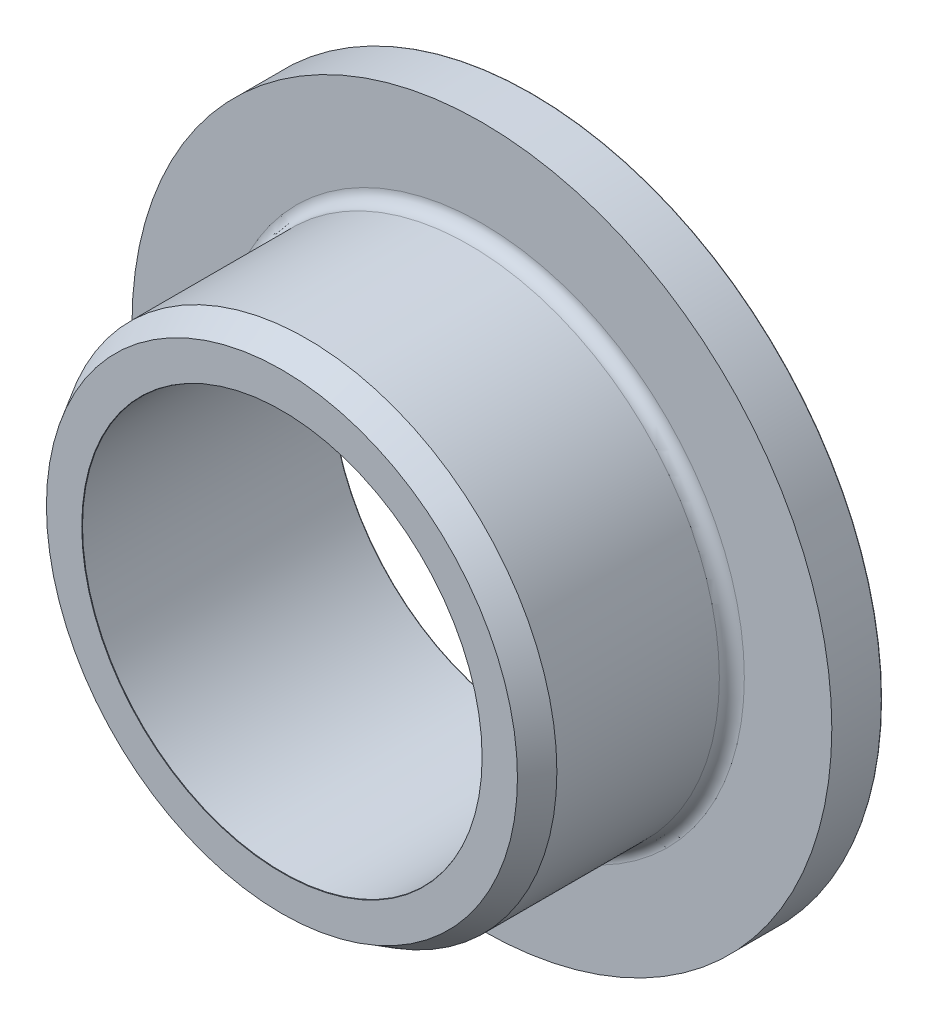
ISO-10303-21;
HEADER;
FILE_DESCRIPTION(('STEP AP214'),'2;1');
FILE_NAME('part.step','',(''),(''),'','','');
FILE_SCHEMA(('AUTOMOTIVE_DESIGN { 1 0 10303 214 1 1 1 1 }'));
ENDSEC;
DATA;
#1=APPLICATION_CONTEXT('core data for automotive mechanical design processes');
#2=APPLICATION_PROTOCOL_DEFINITION('international standard','automotive_design',2000,#1);
#3=PRODUCT_CONTEXT('',#1,'mechanical');
#4=PRODUCT('Part','Part','',(#3));
#5=PRODUCT_RELATED_PRODUCT_CATEGORY('part','',(#4));
#6=PRODUCT_DEFINITION_FORMATION('','',#4);
#7=PRODUCT_DEFINITION_CONTEXT('part definition',#1,'design');
#8=PRODUCT_DEFINITION('design','',#6,#7);
#9=PRODUCT_DEFINITION_SHAPE('','',#8);
#10=(LENGTH_UNIT() NAMED_UNIT(*) SI_UNIT(.MILLI.,.METRE.));
#11=(NAMED_UNIT(*) PLANE_ANGLE_UNIT() SI_UNIT($,.RADIAN.));
#12=(NAMED_UNIT(*) SI_UNIT($,.STERADIAN.) SOLID_ANGLE_UNIT());
#13=UNCERTAINTY_MEASURE_WITH_UNIT(LENGTH_MEASURE(1.E-05),#10,'distance_accuracy_value','');
#14=(GEOMETRIC_REPRESENTATION_CONTEXT(3) GLOBAL_UNCERTAINTY_ASSIGNED_CONTEXT((#13)) GLOBAL_UNIT_ASSIGNED_CONTEXT((#10,
#11,#12)) REPRESENTATION_CONTEXT('',''));
#15=CARTESIAN_POINT('',(0.,0.,0.));
#16=DIRECTION('',(0.,0.,1.));
#17=DIRECTION('',(1.,0.,0.));
#18=AXIS2_PLACEMENT_3D('',#15,#16,#17);
#19=CARTESIAN_POINT('',(0.,0.,4.5));
#20=DIRECTION('',(0.,0.,-1.));
#21=DIRECTION('',(1.,0.,0.));
#22=AXIS2_PLACEMENT_3D('',#19,#20,#21);
#23=CONICAL_SURFACE('',#22,5.,0.523598775598);
#24=DIRECTION('',(-0.50000000000019,0.,0.866025403784329));
#25=VECTOR('',#24,1.);
#26=CARTESIAN_POINT('',(5.,0.,4.5));
#27=LINE('',#26,#25);
#28=CARTESIAN_POINT('',(5.,0.,4.5));
#29=VERTEX_POINT('',#28);
#30=CARTESIAN_POINT('',(4.711324865405,0.,5.));
#31=VERTEX_POINT('',#30);
#32=EDGE_CURVE('E11',#29,#31,#27,.T.);
#33=ORIENTED_EDGE('',*,*,#32,.F.);
#34=CARTESIAN_POINT('',(0.,0.,4.5));
#35=DIRECTION('',(0.,0.,1.));
#36=DIRECTION('',(1.,0.,0.));
#37=AXIS2_PLACEMENT_3D('',#34,#35,#36);
#38=CIRCLE('',#37,5.);
#39=EDGE_CURVE('E136',#29,#29,#38,.T.);
#40=ORIENTED_EDGE('',*,*,#39,.T.);
#41=ORIENTED_EDGE('',*,*,#32,.T.);
#42=CARTESIAN_POINT('',(0.,0.,5.));
#43=DIRECTION('',(0.,0.,1.));
#44=DIRECTION('',(1.,0.,0.));
#45=AXIS2_PLACEMENT_3D('',#42,#43,#44);
#46=CIRCLE('',#45,4.711324865405);
#47=EDGE_CURVE('E111',#31,#31,#46,.T.);
#48=ORIENTED_EDGE('',*,*,#47,.F.);
#49=EDGE_LOOP('',(#33,#40,#41,#48));
#50=FACE_BOUND('',#49,.T.);
#51=ADVANCED_FACE('F17',(#50),#23,.T.);
#52=CARTESIAN_POINT('',(0.,0.,0.));
#53=DIRECTION('',(0.,0.,-1.));
#54=DIRECTION('',(1.,0.,0.));
#55=AXIS2_PLACEMENT_3D('',#52,#53,#54);
#56=CYLINDRICAL_SURFACE('',#55,5.);
#57=ORIENTED_EDGE('',*,*,#39,.F.);
#58=DIRECTION('',(0.,0.,1.));
#59=VECTOR('',#58,1.);
#60=CARTESIAN_POINT('',(5.,0.,0.));
#61=LINE('',#60,#59);
#62=CARTESIAN_POINT('',(5.,0.,1.2499));
#63=VERTEX_POINT('',#62);
#64=EDGE_CURVE('E25',#63,#29,#61,.T.);
#65=ORIENTED_EDGE('',*,*,#64,.F.);
#66=CARTESIAN_POINT('',(0.,0.,1.2499));
#67=DIRECTION('',(0.,0.,-1.));
#68=DIRECTION('',(1.,0.,0.));
#69=AXIS2_PLACEMENT_3D('',#66,#67,#68);
#70=CIRCLE('',#69,5.);
#71=EDGE_CURVE('E107',#63,#63,#70,.T.);
#72=ORIENTED_EDGE('',*,*,#71,.F.);
#73=ORIENTED_EDGE('',*,*,#64,.T.);
#74=EDGE_LOOP('',(#57,#65,#72,#73));
#75=FACE_BOUND('',#74,.T.);
#76=ADVANCED_FACE('F164',(#75),#56,.T.);
#77=CARTESIAN_POINT('',(0.,0.,5.));
#78=DIRECTION('',(0.,0.,1.));
#79=DIRECTION('',(1.,0.,0.));
#80=AXIS2_PLACEMENT_3D('',#77,#78,#79);
#81=PLANE('',#80);
#82=ORIENTED_EDGE('',*,*,#47,.T.);
#83=EDGE_LOOP('',(#82));
#84=FACE_BOUND('',#83,.T.);
#85=CARTESIAN_POINT('',(0.,0.,5.));
#86=DIRECTION('',(0.,0.,1.));
#87=DIRECTION('',(1.,0.,0.));
#88=AXIS2_PLACEMENT_3D('',#85,#86,#87);
#89=CIRCLE('',#88,4.004663076582);
#90=CARTESIAN_POINT('',(4.004663076582,0.,5.));
#91=VERTEX_POINT('',#90);
#92=EDGE_CURVE('E130',#91,#91,#89,.T.);
#93=ORIENTED_EDGE('',*,*,#92,.F.);
#94=EDGE_LOOP('',(#93));
#95=FACE_BOUND('',#94,.T.);
#96=ADVANCED_FACE('F166',(#84,#95),#81,.T.);
#97=CARTESIAN_POINT('',(0.,0.,1.2499));
#98=DIRECTION('',(0.,0.,1.));
#99=DIRECTION('',(1.,0.,0.));
#100=AXIS2_PLACEMENT_3D('',#97,#98,#99);
#101=TOROIDAL_SURFACE('',#100,5.2499,0.2499);
#102=CARTESIAN_POINT('',(5.2499,0.,1.2499));
#103=DIRECTION('',(0.,-1.,0.));
#104=DIRECTION('',(1.,0.,0.));
#105=AXIS2_PLACEMENT_3D('',#102,#103,#104);
#106=CIRCLE('',#105,0.2499);
#107=CARTESIAN_POINT('',(5.2499,0.,1.));
#108=VERTEX_POINT('',#107);
#109=EDGE_CURVE('E112',#63,#108,#106,.T.);
#110=ORIENTED_EDGE('',*,*,#109,.F.);
#111=ORIENTED_EDGE('',*,*,#71,.T.);
#112=ORIENTED_EDGE('',*,*,#109,.T.);
#113=CARTESIAN_POINT('',(0.,0.,1.));
#114=DIRECTION('',(0.,0.,-1.));
#115=DIRECTION('',(1.,0.,0.));
#116=AXIS2_PLACEMENT_3D('',#113,#114,#115);
#117=CIRCLE('',#116,5.2499);
#118=EDGE_CURVE('E126',#108,#108,#117,.T.);
#119=ORIENTED_EDGE('',*,*,#118,.F.);
#120=EDGE_LOOP('',(#110,#111,#112,#119));
#121=FACE_BOUND('',#120,.T.);
#122=ADVANCED_FACE('F163',(#121),#101,.F.);
#123=CARTESIAN_POINT('',(0.,0.,4.99));
#124=DIRECTION('',(0.,0.,1.));
#125=DIRECTION('',(1.,0.,0.));
#126=AXIS2_PLACEMENT_3D('',#123,#124,#125);
#127=CONICAL_SURFACE('',#126,4.,0.436332312999);
#128=ORIENTED_EDGE('',*,*,#92,.T.);
#129=DIRECTION('',(0.422618261740812,0.,0.906307787036597));
#130=VECTOR('',#129,1.);
#131=CARTESIAN_POINT('',(4.,0.,4.99));
#132=LINE('',#131,#130);
#133=CARTESIAN_POINT('',(4.,0.,4.99));
#134=VERTEX_POINT('',#133);
#135=EDGE_CURVE('E118',#134,#91,#132,.T.);
#136=ORIENTED_EDGE('',*,*,#135,.F.);
#137=CARTESIAN_POINT('',(0.,0.,4.99));
#138=DIRECTION('',(0.,0.,1.));
#139=DIRECTION('',(1.,0.,0.));
#140=AXIS2_PLACEMENT_3D('',#137,#138,#139);
#141=CIRCLE('',#140,4.);
#142=EDGE_CURVE('E122',#134,#134,#141,.T.);
#143=ORIENTED_EDGE('',*,*,#142,.F.);
#144=ORIENTED_EDGE('',*,*,#135,.T.);
#145=EDGE_LOOP('',(#128,#136,#143,#144));
#146=FACE_BOUND('',#145,.T.);
#147=ADVANCED_FACE('F158',(#146),#127,.F.);
#148=CARTESIAN_POINT('',(0.,0.,1.));
#149=DIRECTION('',(0.,0.,1.));
#150=DIRECTION('',(1.,0.,0.));
#151=AXIS2_PLACEMENT_3D('',#148,#149,#150);
#152=PLANE('',#151);
#153=CARTESIAN_POINT('',(0.,0.,1.));
#154=DIRECTION('',(0.,0.,1.));
#155=DIRECTION('',(1.,0.,0.));
#156=AXIS2_PLACEMENT_3D('',#153,#154,#155);
#157=CIRCLE('',#156,7.);
#158=CARTESIAN_POINT('',(7.,0.,1.));
#159=VERTEX_POINT('',#158);
#160=EDGE_CURVE('E113',#159,#159,#157,.T.);
#161=ORIENTED_EDGE('',*,*,#160,.T.);
#162=EDGE_LOOP('',(#161));
#163=FACE_BOUND('',#162,.T.);
#164=ORIENTED_EDGE('',*,*,#118,.T.);
#165=EDGE_LOOP('',(#164));
#166=FACE_BOUND('',#165,.T.);
#167=ADVANCED_FACE('F154',(#163,#166),#152,.T.);
#168=CARTESIAN_POINT('',(0.,0.,0.));
#169=DIRECTION('',(0.,0.,-1.));
#170=DIRECTION('',(1.,0.,0.));
#171=AXIS2_PLACEMENT_3D('',#168,#169,#170);
#172=CYLINDRICAL_SURFACE('',#171,4.);
#173=DIRECTION('',(0.,0.,1.));
#174=VECTOR('',#173,1.);
#175=CARTESIAN_POINT('',(4.,0.,0.));
#176=LINE('',#175,#174);
#177=CARTESIAN_POINT('',(4.,0.,0.01));
#178=VERTEX_POINT('',#177);
#179=EDGE_CURVE('E116',#178,#134,#176,.T.);
#180=ORIENTED_EDGE('',*,*,#179,.T.);
#181=ORIENTED_EDGE('',*,*,#142,.T.);
#182=ORIENTED_EDGE('',*,*,#179,.F.);
#183=CARTESIAN_POINT('',(0.,0.,0.01));
#184=DIRECTION('',(0.,0.,1.));
#185=DIRECTION('',(1.,0.,0.));
#186=AXIS2_PLACEMENT_3D('',#183,#184,#185);
#187=CIRCLE('',#186,4.);
#188=EDGE_CURVE('E101',#178,#178,#187,.T.);
#189=ORIENTED_EDGE('',*,*,#188,.F.);
#190=EDGE_LOOP('',(#180,#181,#182,#189));
#191=FACE_BOUND('',#190,.T.);
#192=ADVANCED_FACE('F157',(#191),#172,.F.);
#193=CARTESIAN_POINT('',(0.,0.,0.));
#194=DIRECTION('',(0.,0.,-1.));
#195=DIRECTION('',(1.,0.,0.));
#196=AXIS2_PLACEMENT_3D('',#193,#194,#195);
#197=CYLINDRICAL_SURFACE('',#196,7.);
#198=CARTESIAN_POINT('',(0.,0.,0.01));
#199=DIRECTION('',(0.,0.,1.));
#200=DIRECTION('',(1.,0.,0.));
#201=AXIS2_PLACEMENT_3D('',#198,#199,#200);
#202=CIRCLE('',#201,7.);
#203=CARTESIAN_POINT('',(7.,0.,0.01));
#204=VERTEX_POINT('',#203);
#205=EDGE_CURVE('E84',#204,#204,#202,.T.);
#206=ORIENTED_EDGE('',*,*,#205,.T.);
#207=DIRECTION('',(0.,0.,1.));
#208=VECTOR('',#207,1.);
#209=CARTESIAN_POINT('',(7.,0.,0.));
#210=LINE('',#209,#208);
#211=EDGE_CURVE('E106',#204,#159,#210,.T.);
#212=ORIENTED_EDGE('',*,*,#211,.T.);
#213=ORIENTED_EDGE('',*,*,#160,.F.);
#214=ORIENTED_EDGE('',*,*,#211,.F.);
#215=EDGE_LOOP('',(#206,#212,#213,#214));
#216=FACE_BOUND('',#215,.T.);
#217=ADVANCED_FACE('F152',(#216),#197,.T.);
#218=CARTESIAN_POINT('',(0.,0.,0.01));
#219=DIRECTION('',(0.,0.,-1.));
#220=DIRECTION('',(1.,0.,0.));
#221=AXIS2_PLACEMENT_3D('',#218,#219,#220);
#222=CONICAL_SURFACE('',#221,4.,0.436332312999);
#223=DIRECTION('',(0.422618261740812,0.,-0.906307787036597));
#224=VECTOR('',#223,1.);
#225=CARTESIAN_POINT('',(4.,0.,0.01));
#226=LINE('',#225,#224);
#227=CARTESIAN_POINT('',(4.004663076582,0.,0.));
#228=VERTEX_POINT('',#227);
#229=EDGE_CURVE('E93',#178,#228,#226,.T.);
#230=ORIENTED_EDGE('',*,*,#229,.F.);
#231=ORIENTED_EDGE('',*,*,#188,.T.);
#232=ORIENTED_EDGE('',*,*,#229,.T.);
#233=CARTESIAN_POINT('',(0.,0.,0.));
#234=DIRECTION('',(0.,0.,1.));
#235=DIRECTION('',(1.,0.,0.));
#236=AXIS2_PLACEMENT_3D('',#233,#234,#235);
#237=CIRCLE('',#236,4.004663076582);
#238=EDGE_CURVE('E86',#228,#228,#237,.T.);
#239=ORIENTED_EDGE('',*,*,#238,.F.);
#240=EDGE_LOOP('',(#230,#231,#232,#239));
#241=FACE_BOUND('',#240,.T.);
#242=ADVANCED_FACE('F180',(#241),#222,.F.);
#243=CARTESIAN_POINT('',(0.,0.,0.01));
#244=DIRECTION('',(0.,0.,1.));
#245=DIRECTION('',(1.,0.,0.));
#246=AXIS2_PLACEMENT_3D('',#243,#244,#245);
#247=CONICAL_SURFACE('',#246,7.,0.436332312999);
#248=CARTESIAN_POINT('',(0.,0.,0.));
#249=DIRECTION('',(0.,0.,1.));
#250=DIRECTION('',(1.,0.,0.));
#251=AXIS2_PLACEMENT_3D('',#248,#249,#250);
#252=CIRCLE('',#251,6.995336923418);
#253=CARTESIAN_POINT('',(6.995336923418,0.,0.));
#254=VERTEX_POINT('',#253);
#255=EDGE_CURVE('E82',#254,#254,#252,.T.);
#256=ORIENTED_EDGE('',*,*,#255,.T.);
#257=DIRECTION('',(-0.422618261740812,0.,-0.906307787036597));
#258=VECTOR('',#257,1.);
#259=CARTESIAN_POINT('',(7.,0.,0.01));
#260=LINE('',#259,#258);
#261=EDGE_CURVE('E79',#204,#254,#260,.T.);
#262=ORIENTED_EDGE('',*,*,#261,.F.);
#263=ORIENTED_EDGE('',*,*,#205,.F.);
#264=ORIENTED_EDGE('',*,*,#261,.T.);
#265=EDGE_LOOP('',(#256,#262,#263,#264));
#266=FACE_BOUND('',#265,.T.);
#267=ADVANCED_FACE('F80',(#266),#247,.T.);
#268=CARTESIAN_POINT('',(0.,0.,0.));
#269=DIRECTION('',(0.,0.,1.));
#270=DIRECTION('',(1.,0.,0.));
#271=AXIS2_PLACEMENT_3D('',#268,#269,#270);
#272=PLANE('',#271);
#273=ORIENTED_EDGE('',*,*,#238,.T.);
#274=EDGE_LOOP('',(#273));
#275=FACE_BOUND('',#274,.T.);
#276=ORIENTED_EDGE('',*,*,#255,.F.);
#277=EDGE_LOOP('',(#276));
#278=FACE_BOUND('',#277,.T.);
#279=ADVANCED_FACE('F186',(#275,#278),#272,.F.);
#280=CLOSED_SHELL('',(#51,#76,#96,#122,#147,#167,#192,#217,#242,#267,#279));
#281=MANIFOLD_SOLID_BREP('B1',#280);
#282=ADVANCED_BREP_SHAPE_REPRESENTATION('',(#18,#281),#14);
#283=SHAPE_DEFINITION_REPRESENTATION(#9,#282);
ENDSEC;
END-ISO-10303-21;
